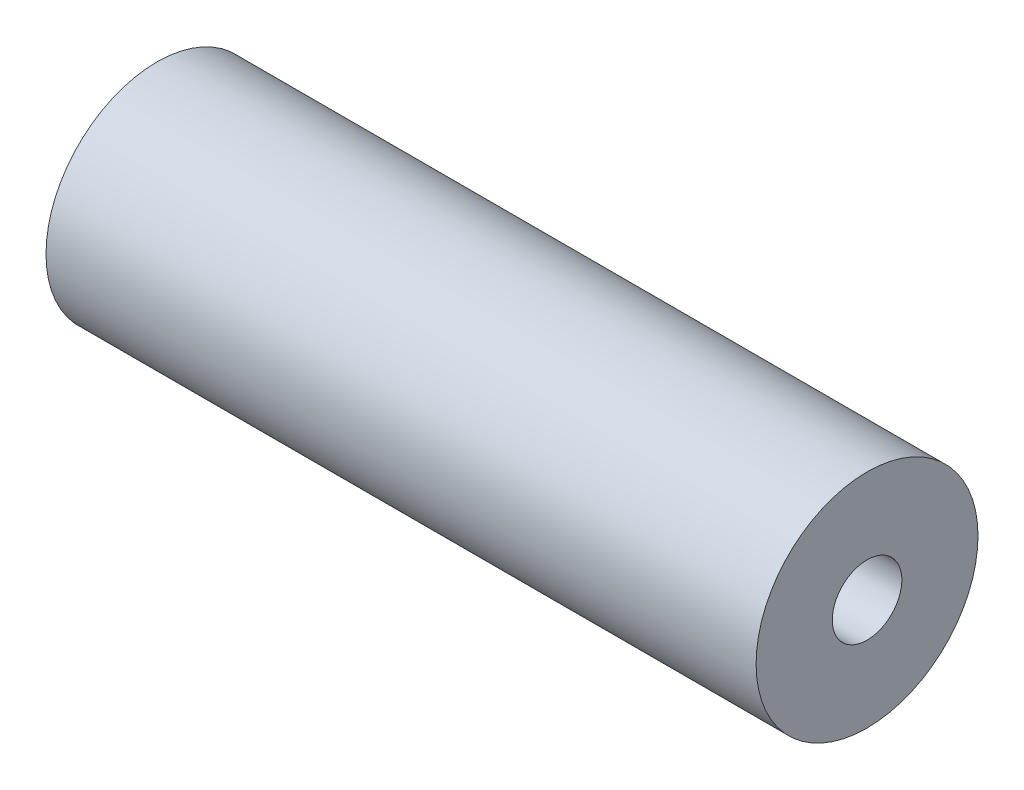
ISO-10303-21;
HEADER;
FILE_DESCRIPTION(('STEP AP214'),'2;1');
FILE_NAME('part.step','',(''),(''),'','','');
FILE_SCHEMA(('AUTOMOTIVE_DESIGN { 1 0 10303 214 1 1 1 1 }'));
ENDSEC;
DATA;
#1=APPLICATION_CONTEXT('core data for automotive mechanical design processes');
#2=APPLICATION_PROTOCOL_DEFINITION('international standard','automotive_design',2000,#1);
#3=PRODUCT_CONTEXT('',#1,'mechanical');
#4=PRODUCT('Part','Part','',(#3));
#5=PRODUCT_RELATED_PRODUCT_CATEGORY('part','',(#4));
#6=PRODUCT_DEFINITION_FORMATION('','',#4);
#7=PRODUCT_DEFINITION_CONTEXT('part definition',#1,'design');
#8=PRODUCT_DEFINITION('design','',#6,#7);
#9=PRODUCT_DEFINITION_SHAPE('','',#8);
#10=(LENGTH_UNIT() NAMED_UNIT(*) SI_UNIT(.MILLI.,.METRE.));
#11=(NAMED_UNIT(*) PLANE_ANGLE_UNIT() SI_UNIT($,.RADIAN.));
#12=(NAMED_UNIT(*) SI_UNIT($,.STERADIAN.) SOLID_ANGLE_UNIT());
#13=UNCERTAINTY_MEASURE_WITH_UNIT(LENGTH_MEASURE(1.E-05),#10,'distance_accuracy_value','');
#14=(GEOMETRIC_REPRESENTATION_CONTEXT(3) GLOBAL_UNCERTAINTY_ASSIGNED_CONTEXT((#13)) GLOBAL_UNIT_ASSIGNED_CONTEXT((#10,
#11,#12)) REPRESENTATION_CONTEXT('',''));
#15=CARTESIAN_POINT('',(0.,0.,0.));
#16=DIRECTION('',(0.,0.,1.));
#17=DIRECTION('',(1.,0.,0.));
#18=AXIS2_PLACEMENT_3D('',#15,#16,#17);
#19=CARTESIAN_POINT('',(-72.8939918967907,0.,0.));
#20=DIRECTION('',(-1.,0.,0.));
#21=DIRECTION('',(0.,0.,1.));
#22=AXIS2_PLACEMENT_3D('',#19,#20,#21);
#23=CYLINDRICAL_SURFACE('',#22,7.9375);
#24=CARTESIAN_POINT('',(-25.4,0.,0.));
#25=DIRECTION('',(-1.,0.,0.));
#26=DIRECTION('',(0.,0.,1.));
#27=AXIS2_PLACEMENT_3D('',#24,#25,#26);
#28=CIRCLE('',#27,7.9375);
#29=CARTESIAN_POINT('',(-25.4,0.,7.9375));
#30=VERTEX_POINT('',#29);
#31=EDGE_CURVE('E46',#30,#30,#28,.T.);
#32=ORIENTED_EDGE('',*,*,#31,.F.);
#33=EDGE_LOOP('',(#32));
#34=FACE_BOUND('',#33,.T.);
#35=CARTESIAN_POINT('',(25.4,0.,0.));
#36=DIRECTION('',(-1.,0.,0.));
#37=DIRECTION('',(0.,0.,1.));
#38=AXIS2_PLACEMENT_3D('',#35,#36,#37);
#39=CIRCLE('',#38,7.9375);
#40=CARTESIAN_POINT('',(25.4,0.,7.9375));
#41=VERTEX_POINT('',#40);
#42=EDGE_CURVE('E10',#41,#41,#39,.T.);
#43=ORIENTED_EDGE('',*,*,#42,.T.);
#44=EDGE_LOOP('',(#43));
#45=FACE_BOUND('',#44,.T.);
#46=ADVANCED_FACE('F32',(#34,#45),#23,.T.);
#47=CARTESIAN_POINT('',(25.4,0.,-7.9375));
#48=DIRECTION('',(-1.,0.,0.));
#49=DIRECTION('',(0.,0.,1.));
#50=AXIS2_PLACEMENT_3D('',#47,#48,#49);
#51=PLANE('',#50);
#52=ORIENTED_EDGE('',*,*,#42,.F.);
#53=EDGE_LOOP('',(#52));
#54=FACE_BOUND('',#53,.T.);
#55=CARTESIAN_POINT('',(25.4,0.,0.));
#56=DIRECTION('',(-1.,0.,0.));
#57=DIRECTION('',(0.,0.,1.));
#58=AXIS2_PLACEMENT_3D('',#55,#56,#57);
#59=CIRCLE('',#58,2.4892);
#60=CARTESIAN_POINT('',(25.4,0.,2.4892));
#61=VERTEX_POINT('',#60);
#62=EDGE_CURVE('E38',#61,#61,#59,.T.);
#63=ORIENTED_EDGE('',*,*,#62,.T.);
#64=EDGE_LOOP('',(#63));
#65=FACE_BOUND('',#64,.T.);
#66=ADVANCED_FACE('F55',(#54,#65),#51,.F.);
#67=CARTESIAN_POINT('',(-72.8939918967907,0.,0.));
#68=DIRECTION('',(-1.,0.,0.));
#69=DIRECTION('',(0.,0.,1.));
#70=AXIS2_PLACEMENT_3D('',#67,#68,#69);
#71=CYLINDRICAL_SURFACE('',#70,2.4892);
#72=ORIENTED_EDGE('',*,*,#62,.F.);
#73=EDGE_LOOP('',(#72));
#74=FACE_BOUND('',#73,.T.);
#75=CARTESIAN_POINT('',(-25.4,0.,0.));
#76=DIRECTION('',(-1.,0.,0.));
#77=DIRECTION('',(0.,0.,1.));
#78=AXIS2_PLACEMENT_3D('',#75,#76,#77);
#79=CIRCLE('',#78,2.4892);
#80=CARTESIAN_POINT('',(-25.4,0.,2.4892));
#81=VERTEX_POINT('',#80);
#82=EDGE_CURVE('E42',#81,#81,#79,.T.);
#83=ORIENTED_EDGE('',*,*,#82,.T.);
#84=EDGE_LOOP('',(#83));
#85=FACE_BOUND('',#84,.T.);
#86=ADVANCED_FACE('F59',(#74,#85),#71,.F.);
#87=CARTESIAN_POINT('',(-25.4,0.,-7.9375));
#88=DIRECTION('',(1.,0.,0.));
#89=DIRECTION('',(0.,0.,-1.));
#90=AXIS2_PLACEMENT_3D('',#87,#88,#89);
#91=PLANE('',#90);
#92=ORIENTED_EDGE('',*,*,#82,.F.);
#93=EDGE_LOOP('',(#92));
#94=FACE_BOUND('',#93,.T.);
#95=ORIENTED_EDGE('',*,*,#31,.T.);
#96=EDGE_LOOP('',(#95));
#97=FACE_BOUND('',#96,.T.);
#98=ADVANCED_FACE('F52',(#94,#97),#91,.F.);
#99=CLOSED_SHELL('',(#46,#66,#86,#98));
#100=MANIFOLD_SOLID_BREP('B2',#99);
#101=ADVANCED_BREP_SHAPE_REPRESENTATION('',(#18,#100),#14);
#102=SHAPE_DEFINITION_REPRESENTATION(#9,#101);
ENDSEC;
END-ISO-10303-21;
